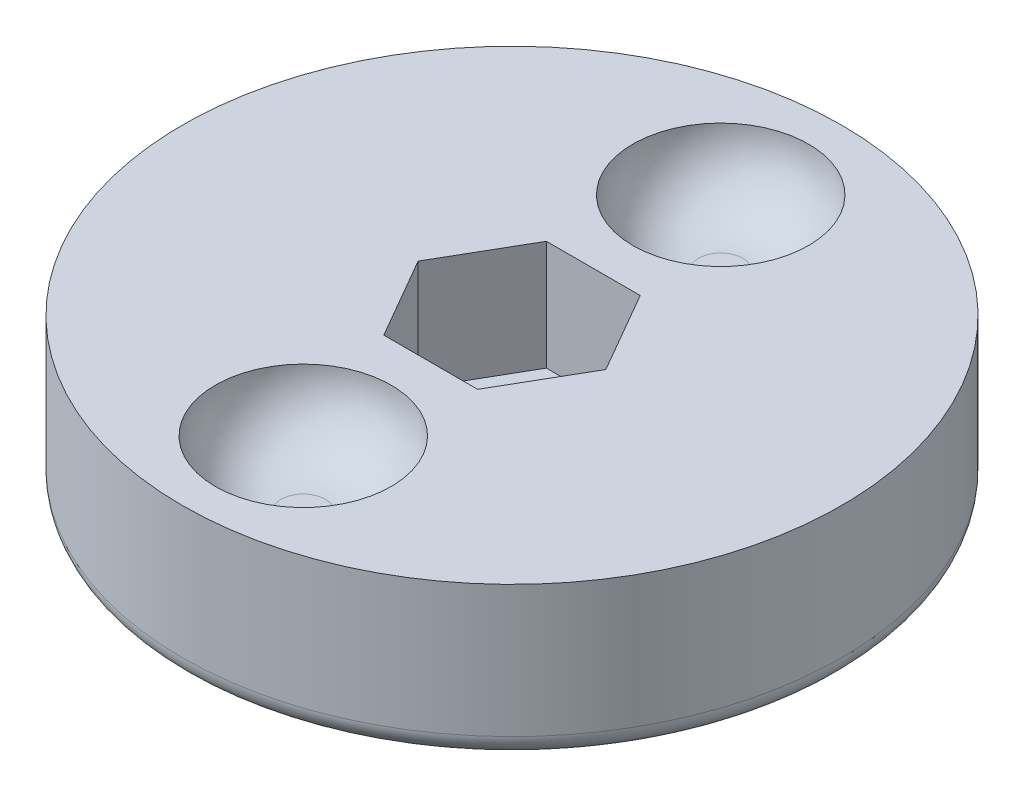
ISO-10303-21;
HEADER;
FILE_DESCRIPTION(('STEP AP214'),'2;1');
FILE_NAME('part.step','',(''),(''),'','','');
FILE_SCHEMA(('AUTOMOTIVE_DESIGN { 1 0 10303 214 1 1 1 1 }'));
ENDSEC;
DATA;
#1=APPLICATION_CONTEXT('core data for automotive mechanical design processes');
#2=APPLICATION_PROTOCOL_DEFINITION('international standard','automotive_design',2000,#1);
#3=PRODUCT_CONTEXT('',#1,'mechanical');
#4=PRODUCT('Part','Part','',(#3));
#5=PRODUCT_RELATED_PRODUCT_CATEGORY('part','',(#4));
#6=PRODUCT_DEFINITION_FORMATION('','',#4);
#7=PRODUCT_DEFINITION_CONTEXT('part definition',#1,'design');
#8=PRODUCT_DEFINITION('design','',#6,#7);
#9=PRODUCT_DEFINITION_SHAPE('','',#8);
#10=(LENGTH_UNIT() NAMED_UNIT(*) SI_UNIT(.MILLI.,.METRE.));
#11=(NAMED_UNIT(*) PLANE_ANGLE_UNIT() SI_UNIT($,.RADIAN.));
#12=(NAMED_UNIT(*) SI_UNIT($,.STERADIAN.) SOLID_ANGLE_UNIT());
#13=UNCERTAINTY_MEASURE_WITH_UNIT(LENGTH_MEASURE(1.E-05),#10,'distance_accuracy_value','');
#14=(GEOMETRIC_REPRESENTATION_CONTEXT(3) GLOBAL_UNCERTAINTY_ASSIGNED_CONTEXT((#13)) GLOBAL_UNIT_ASSIGNED_CONTEXT((#10,
#11,#12)) REPRESENTATION_CONTEXT('',''));
#15=CARTESIAN_POINT('',(0.,0.,0.));
#16=DIRECTION('',(0.,0.,1.));
#17=DIRECTION('',(1.,0.,0.));
#18=AXIS2_PLACEMENT_3D('',#15,#16,#17);
#19=CARTESIAN_POINT('',(0.,2.54,0.));
#20=DIRECTION('',(0.,1.,0.));
#21=DIRECTION('',(0.,0.,1.));
#22=AXIS2_PLACEMENT_3D('',#19,#20,#21);
#23=PLANE('',#22);
#24=CARTESIAN_POINT('',(0.,2.54,0.));
#25=DIRECTION('',(0.,1.,0.));
#26=DIRECTION('',(0.,0.,1.));
#27=AXIS2_PLACEMENT_3D('',#24,#25,#26);
#28=CIRCLE('',#27,2.794);
#29=CARTESIAN_POINT('',(0.,2.54,2.794));
#30=VERTEX_POINT('',#29);
#31=EDGE_CURVE('E175',#30,#30,#28,.T.);
#32=ORIENTED_EDGE('',*,*,#31,.F.);
#33=EDGE_LOOP('',(#32));
#34=FACE_BOUND('',#33,.T.);
#35=DIRECTION('',(1.,0.,0.));
#36=VECTOR('',#35,1.);
#37=CARTESIAN_POINT('',(-2.71296891492205,2.54,4.699));
#38=LINE('',#37,#36);
#39=CARTESIAN_POINT('',(-2.71296891492205,2.54,4.699));
#40=VERTEX_POINT('',#39);
#41=CARTESIAN_POINT('',(2.71296891492205,2.54,4.699));
#42=VERTEX_POINT('',#41);
#43=EDGE_CURVE('E108',#40,#42,#38,.T.);
#44=ORIENTED_EDGE('',*,*,#43,.T.);
#45=DIRECTION('',(0.5,0.,-0.866025403784439));
#46=VECTOR('',#45,1.);
#47=CARTESIAN_POINT('',(2.71296891492205,2.54,4.699));
#48=LINE('',#47,#46);
#49=CARTESIAN_POINT('',(5.4259378298441,2.54,0.));
#50=VERTEX_POINT('',#49);
#51=EDGE_CURVE('E138',#42,#50,#48,.T.);
#52=ORIENTED_EDGE('',*,*,#51,.T.);
#53=DIRECTION('',(-0.5,0.,-0.866025403784439));
#54=VECTOR('',#53,1.);
#55=CARTESIAN_POINT('',(5.4259378298441,2.54,0.));
#56=LINE('',#55,#54);
#57=CARTESIAN_POINT('',(2.71296891492205,2.54,-4.699));
#58=VERTEX_POINT('',#57);
#59=EDGE_CURVE('E114',#50,#58,#56,.T.);
#60=ORIENTED_EDGE('',*,*,#59,.T.);
#61=DIRECTION('',(-1.,0.,0.));
#62=VECTOR('',#61,1.);
#63=CARTESIAN_POINT('',(2.71296891492205,2.54,-4.699));
#64=LINE('',#63,#62);
#65=CARTESIAN_POINT('',(-2.71296891492205,2.54,-4.699));
#66=VERTEX_POINT('',#65);
#67=EDGE_CURVE('E144',#58,#66,#64,.T.);
#68=ORIENTED_EDGE('',*,*,#67,.T.);
#69=DIRECTION('',(-0.5,0.,0.866025403784438));
#70=VECTOR('',#69,1.);
#71=CARTESIAN_POINT('',(-2.71296891492205,2.54,-4.699));
#72=LINE('',#71,#70);
#73=CARTESIAN_POINT('',(-5.4259378298441,2.54,0.));
#74=VERTEX_POINT('',#73);
#75=EDGE_CURVE('E148',#66,#74,#72,.T.);
#76=ORIENTED_EDGE('',*,*,#75,.T.);
#77=DIRECTION('',(0.5,0.,0.866025403784439));
#78=VECTOR('',#77,1.);
#79=CARTESIAN_POINT('',(-5.4259378298441,2.54,0.));
#80=LINE('',#79,#78);
#81=EDGE_CURVE('E152',#74,#40,#80,.T.);
#82=ORIENTED_EDGE('',*,*,#81,.T.);
#83=EDGE_LOOP('',(#44,#52,#60,#68,#76,#82));
#84=FACE_BOUND('',#83,.T.);
#85=ADVANCED_FACE('F45',(#34,#84),#23,.T.);
#86=CARTESIAN_POINT('',(0.,0.,0.));
#87=DIRECTION('',(0.,1.,0.));
#88=DIRECTION('',(0.,0.,1.));
#89=AXIS2_PLACEMENT_3D('',#86,#87,#88);
#90=PLANE('',#89);
#91=CARTESIAN_POINT('',(0.,0.,0.));
#92=DIRECTION('',(0.,1.,0.));
#93=DIRECTION('',(0.,0.,1.));
#94=AXIS2_PLACEMENT_3D('',#91,#92,#93);
#95=CIRCLE('',#94,17.78);
#96=CARTESIAN_POINT('',(0.,0.,17.78));
#97=VERTEX_POINT('',#96);
#98=EDGE_CURVE('E11',#97,#97,#95,.F.);
#99=ORIENTED_EDGE('',*,*,#98,.T.);
#100=EDGE_LOOP('',(#99));
#101=FACE_BOUND('',#100,.T.);
#102=CARTESIAN_POINT('',(0.,0.,0.));
#103=DIRECTION('',(0.,1.,0.));
#104=DIRECTION('',(0.,0.,1.));
#105=AXIS2_PLACEMENT_3D('',#102,#103,#104);
#106=CIRCLE('',#105,2.794);
#107=CARTESIAN_POINT('',(0.,0.,2.794));
#108=VERTEX_POINT('',#107);
#109=EDGE_CURVE('E174',#108,#108,#106,.T.);
#110=ORIENTED_EDGE('',*,*,#109,.T.);
#111=EDGE_LOOP('',(#110));
#112=FACE_BOUND('',#111,.T.);
#113=ADVANCED_FACE('F207',(#101,#112),#90,.F.);
#114=CARTESIAN_POINT('',(0.,2.54,0.));
#115=DIRECTION('',(0.,-1.,0.));
#116=DIRECTION('',(0.,0.,-1.));
#117=AXIS2_PLACEMENT_3D('',#114,#115,#116);
#118=CYLINDRICAL_SURFACE('',#117,19.05);
#119=CARTESIAN_POINT('',(0.,1.27,0.));
#120=DIRECTION('',(0.,1.,0.));
#121=DIRECTION('',(0.,0.,1.));
#122=AXIS2_PLACEMENT_3D('',#119,#120,#121);
#123=CIRCLE('',#122,19.05);
#124=CARTESIAN_POINT('',(0.,1.27,19.05));
#125=VERTEX_POINT('',#124);
#126=EDGE_CURVE('E54',#125,#125,#123,.T.);
#127=ORIENTED_EDGE('',*,*,#126,.T.);
#128=EDGE_LOOP('',(#127));
#129=FACE_BOUND('',#128,.T.);
#130=CARTESIAN_POINT('',(0.,8.89,0.));
#131=DIRECTION('',(0.,1.,0.));
#132=DIRECTION('',(0.,0.,1.));
#133=AXIS2_PLACEMENT_3D('',#130,#131,#132);
#134=CIRCLE('',#133,19.05);
#135=CARTESIAN_POINT('',(0.,8.89,19.05));
#136=VERTEX_POINT('',#135);
#137=EDGE_CURVE('E116',#136,#136,#134,.T.);
#138=ORIENTED_EDGE('',*,*,#137,.F.);
#139=EDGE_LOOP('',(#138));
#140=FACE_BOUND('',#139,.T.);
#141=ADVANCED_FACE('F193',(#129,#140),#118,.T.);
#142=CARTESIAN_POINT('',(0.,2.54,0.));
#143=DIRECTION('',(0.,-1.,0.));
#144=DIRECTION('',(0.,0.,-1.));
#145=AXIS2_PLACEMENT_3D('',#142,#143,#144);
#146=CYLINDRICAL_SURFACE('',#145,2.794);
#147=ORIENTED_EDGE('',*,*,#31,.T.);
#148=EDGE_LOOP('',(#147));
#149=FACE_BOUND('',#148,.T.);
#150=ORIENTED_EDGE('',*,*,#109,.F.);
#151=EDGE_LOOP('',(#150));
#152=FACE_BOUND('',#151,.T.);
#153=ADVANCED_FACE('F220',(#149,#152),#146,.F.);
#154=CARTESIAN_POINT('',(0.,8.89,0.));
#155=DIRECTION('',(0.,1.,0.));
#156=DIRECTION('',(0.,0.,1.));
#157=AXIS2_PLACEMENT_3D('',#154,#155,#156);
#158=PLANE('',#157);
#159=CARTESIAN_POINT('',(0.,8.89,-12.065));
#160=DIRECTION('',(0.,1.,0.));
#161=DIRECTION('',(0.,0.,1.));
#162=AXIS2_PLACEMENT_3D('',#159,#160,#161);
#163=CIRCLE('',#162,5.08);
#164=CARTESIAN_POINT('',(0.,8.89,-6.985));
#165=VERTEX_POINT('',#164);
#166=EDGE_CURVE('E141',#165,#165,#163,.T.);
#167=ORIENTED_EDGE('',*,*,#166,.F.);
#168=EDGE_LOOP('',(#167));
#169=FACE_BOUND('',#168,.T.);
#170=CARTESIAN_POINT('',(0.,8.89,12.065));
#171=DIRECTION('',(0.,1.,0.));
#172=DIRECTION('',(0.,0.,1.));
#173=AXIS2_PLACEMENT_3D('',#170,#171,#172);
#174=CIRCLE('',#173,5.08);
#175=CARTESIAN_POINT('',(0.,8.89,17.145));
#176=VERTEX_POINT('',#175);
#177=EDGE_CURVE('E236',#176,#176,#174,.T.);
#178=ORIENTED_EDGE('',*,*,#177,.F.);
#179=EDGE_LOOP('',(#178));
#180=FACE_BOUND('',#179,.T.);
#181=ORIENTED_EDGE('',*,*,#137,.T.);
#182=EDGE_LOOP('',(#181));
#183=FACE_BOUND('',#182,.T.);
#184=DIRECTION('',(-0.5,0.,-0.866025403784439));
#185=VECTOR('',#184,1.);
#186=CARTESIAN_POINT('',(5.4259378298441,8.89,0.));
#187=LINE('',#186,#185);
#188=CARTESIAN_POINT('',(5.4259378298441,8.89,0.));
#189=VERTEX_POINT('',#188);
#190=CARTESIAN_POINT('',(2.71296891492205,8.89,-4.699));
#191=VERTEX_POINT('',#190);
#192=EDGE_CURVE('E107',#189,#191,#187,.T.);
#193=ORIENTED_EDGE('',*,*,#192,.F.);
#194=DIRECTION('',(0.5,0.,-0.866025403784439));
#195=VECTOR('',#194,1.);
#196=CARTESIAN_POINT('',(2.71296891492205,8.89,4.699));
#197=LINE('',#196,#195);
#198=CARTESIAN_POINT('',(2.71296891492205,8.89,4.699));
#199=VERTEX_POINT('',#198);
#200=EDGE_CURVE('E98',#199,#189,#197,.T.);
#201=ORIENTED_EDGE('',*,*,#200,.F.);
#202=DIRECTION('',(1.,0.,0.));
#203=VECTOR('',#202,1.);
#204=CARTESIAN_POINT('',(-2.71296891492205,8.89,4.699));
#205=LINE('',#204,#203);
#206=CARTESIAN_POINT('',(-2.71296891492205,8.89,4.699));
#207=VERTEX_POINT('',#206);
#208=EDGE_CURVE('E135',#207,#199,#205,.T.);
#209=ORIENTED_EDGE('',*,*,#208,.F.);
#210=DIRECTION('',(0.5,0.,0.866025403784439));
#211=VECTOR('',#210,1.);
#212=CARTESIAN_POINT('',(-5.4259378298441,8.89,0.));
#213=LINE('',#212,#211);
#214=CARTESIAN_POINT('',(-5.4259378298441,8.89,0.));
#215=VERTEX_POINT('',#214);
#216=EDGE_CURVE('E132',#215,#207,#213,.T.);
#217=ORIENTED_EDGE('',*,*,#216,.F.);
#218=DIRECTION('',(-0.5,0.,0.866025403784438));
#219=VECTOR('',#218,1.);
#220=CARTESIAN_POINT('',(-2.71296891492205,8.89,-4.699));
#221=LINE('',#220,#219);
#222=CARTESIAN_POINT('',(-2.71296891492205,8.89,-4.699));
#223=VERTEX_POINT('',#222);
#224=EDGE_CURVE('E126',#223,#215,#221,.T.);
#225=ORIENTED_EDGE('',*,*,#224,.F.);
#226=DIRECTION('',(-1.,0.,0.));
#227=VECTOR('',#226,1.);
#228=CARTESIAN_POINT('',(2.71296891492205,8.89,-4.699));
#229=LINE('',#228,#227);
#230=EDGE_CURVE('E122',#191,#223,#229,.T.);
#231=ORIENTED_EDGE('',*,*,#230,.F.);
#232=EDGE_LOOP('',(#193,#201,#209,#217,#225,#231));
#233=FACE_BOUND('',#232,.T.);
#234=ADVANCED_FACE('F120',(#169,#180,#183,#233),#158,.T.);
#235=CARTESIAN_POINT('',(2.71296891492205,8.89,4.699));
#236=DIRECTION('',(-0.866025403784439,0.,-0.5));
#237=DIRECTION('',(-0.5,0.,0.866025403784439));
#238=AXIS2_PLACEMENT_3D('',#235,#236,#237);
#239=PLANE('',#238);
#240=ORIENTED_EDGE('',*,*,#51,.F.);
#241=DIRECTION('',(0.,-1.,0.));
#242=VECTOR('',#241,1.);
#243=CARTESIAN_POINT('',(2.71296891492205,8.89,4.699));
#244=LINE('',#243,#242);
#245=EDGE_CURVE('E61',#199,#42,#244,.T.);
#246=ORIENTED_EDGE('',*,*,#245,.F.);
#247=ORIENTED_EDGE('',*,*,#200,.T.);
#248=DIRECTION('',(0.,-1.,0.));
#249=VECTOR('',#248,1.);
#250=CARTESIAN_POINT('',(5.4259378298441,8.89,0.));
#251=LINE('',#250,#249);
#252=EDGE_CURVE('E101',#189,#50,#251,.T.);
#253=ORIENTED_EDGE('',*,*,#252,.T.);
#254=EDGE_LOOP('',(#240,#246,#247,#253));
#255=FACE_BOUND('',#254,.T.);
#256=ADVANCED_FACE('F100',(#255),#239,.T.);
#257=CARTESIAN_POINT('',(5.4259378298441,8.89,0.));
#258=DIRECTION('',(-0.866025403784438,0.,0.5));
#259=DIRECTION('',(0.5,0.,0.866025403784439));
#260=AXIS2_PLACEMENT_3D('',#257,#258,#259);
#261=PLANE('',#260);
#262=ORIENTED_EDGE('',*,*,#59,.F.);
#263=ORIENTED_EDGE('',*,*,#252,.F.);
#264=ORIENTED_EDGE('',*,*,#192,.T.);
#265=DIRECTION('',(0.,-1.,0.));
#266=VECTOR('',#265,1.);
#267=CARTESIAN_POINT('',(2.71296891492205,8.89,-4.699));
#268=LINE('',#267,#266);
#269=EDGE_CURVE('E117',#191,#58,#268,.T.);
#270=ORIENTED_EDGE('',*,*,#269,.T.);
#271=EDGE_LOOP('',(#262,#263,#264,#270));
#272=FACE_BOUND('',#271,.T.);
#273=ADVANCED_FACE('F111',(#272),#261,.T.);
#274=CARTESIAN_POINT('',(2.71296891492205,8.89,-4.699));
#275=DIRECTION('',(0.,0.,1.));
#276=DIRECTION('',(1.,0.,0.));
#277=AXIS2_PLACEMENT_3D('',#274,#275,#276);
#278=PLANE('',#277);
#279=ORIENTED_EDGE('',*,*,#67,.F.);
#280=ORIENTED_EDGE('',*,*,#269,.F.);
#281=ORIENTED_EDGE('',*,*,#230,.T.);
#282=DIRECTION('',(0.,-1.,0.));
#283=VECTOR('',#282,1.);
#284=CARTESIAN_POINT('',(-2.71296891492205,8.89,-4.699));
#285=LINE('',#284,#283);
#286=EDGE_CURVE('E166',#223,#66,#285,.T.);
#287=ORIENTED_EDGE('',*,*,#286,.T.);
#288=EDGE_LOOP('',(#279,#280,#281,#287));
#289=FACE_BOUND('',#288,.T.);
#290=ADVANCED_FACE('F255',(#289),#278,.T.);
#291=CARTESIAN_POINT('',(-2.71296891492205,8.89,-4.699));
#292=DIRECTION('',(0.866025403784438,0.,0.5));
#293=DIRECTION('',(0.5,0.,-0.866025403784439));
#294=AXIS2_PLACEMENT_3D('',#291,#292,#293);
#295=PLANE('',#294);
#296=ORIENTED_EDGE('',*,*,#75,.F.);
#297=ORIENTED_EDGE('',*,*,#286,.F.);
#298=ORIENTED_EDGE('',*,*,#224,.T.);
#299=DIRECTION('',(0.,-1.,0.));
#300=VECTOR('',#299,1.);
#301=CARTESIAN_POINT('',(-5.4259378298441,8.89,0.));
#302=LINE('',#301,#300);
#303=EDGE_CURVE('E163',#215,#74,#302,.T.);
#304=ORIENTED_EDGE('',*,*,#303,.T.);
#305=EDGE_LOOP('',(#296,#297,#298,#304));
#306=FACE_BOUND('',#305,.T.);
#307=ADVANCED_FACE('F251',(#306),#295,.T.);
#308=CARTESIAN_POINT('',(-5.4259378298441,8.89,0.));
#309=DIRECTION('',(0.866025403784438,0.,-0.5));
#310=DIRECTION('',(-0.5,0.,-0.866025403784439));
#311=AXIS2_PLACEMENT_3D('',#308,#309,#310);
#312=PLANE('',#311);
#313=ORIENTED_EDGE('',*,*,#81,.F.);
#314=ORIENTED_EDGE('',*,*,#303,.F.);
#315=ORIENTED_EDGE('',*,*,#216,.T.);
#316=DIRECTION('',(0.,-1.,0.));
#317=VECTOR('',#316,1.);
#318=CARTESIAN_POINT('',(-2.71296891492205,8.89,4.699));
#319=LINE('',#318,#317);
#320=EDGE_CURVE('E66',#207,#40,#319,.T.);
#321=ORIENTED_EDGE('',*,*,#320,.T.);
#322=EDGE_LOOP('',(#313,#314,#315,#321));
#323=FACE_BOUND('',#322,.T.);
#324=ADVANCED_FACE('F246',(#323),#312,.T.);
#325=CARTESIAN_POINT('',(-2.71296891492205,8.89,4.699));
#326=DIRECTION('',(0.,0.,-1.));
#327=DIRECTION('',(-1.,0.,0.));
#328=AXIS2_PLACEMENT_3D('',#325,#326,#327);
#329=PLANE('',#328);
#330=ORIENTED_EDGE('',*,*,#43,.F.);
#331=ORIENTED_EDGE('',*,*,#320,.F.);
#332=ORIENTED_EDGE('',*,*,#208,.T.);
#333=ORIENTED_EDGE('',*,*,#245,.T.);
#334=EDGE_LOOP('',(#330,#331,#332,#333));
#335=FACE_BOUND('',#334,.T.);
#336=ADVANCED_FACE('F240',(#335),#329,.T.);
#337=CARTESIAN_POINT('',(0.,5.08,12.065));
#338=DIRECTION('',(0.,1.,0.));
#339=DIRECTION('',(0.,0.,1.));
#340=AXIS2_PLACEMENT_3D('',#337,#338,#339);
#341=PLANE('',#340);
#342=CARTESIAN_POINT('',(0.,5.08,12.065));
#343=DIRECTION('',(0.,1.,0.));
#344=DIRECTION('',(0.,0.,1.));
#345=AXIS2_PLACEMENT_3D('',#342,#343,#344);
#346=CIRCLE('',#345,1.27);
#347=CARTESIAN_POINT('',(0.,5.08,13.335));
#348=VERTEX_POINT('',#347);
#349=EDGE_CURVE('E179',#348,#348,#346,.T.);
#350=ORIENTED_EDGE('',*,*,#349,.T.);
#351=EDGE_LOOP('',(#350));
#352=FACE_BOUND('',#351,.T.);
#353=ADVANCED_FACE('F230',(#352),#341,.T.);
#354=CARTESIAN_POINT('',(0.,5.08,-12.065));
#355=DIRECTION('',(0.,1.,0.));
#356=DIRECTION('',(0.,0.,1.));
#357=AXIS2_PLACEMENT_3D('',#354,#355,#356);
#358=PLANE('',#357);
#359=CARTESIAN_POINT('',(0.,5.08,-12.065));
#360=DIRECTION('',(0.,1.,0.));
#361=DIRECTION('',(0.,0.,1.));
#362=AXIS2_PLACEMENT_3D('',#359,#360,#361);
#363=CIRCLE('',#362,1.27);
#364=CARTESIAN_POINT('',(0.,5.08,-10.795));
#365=VERTEX_POINT('',#364);
#366=EDGE_CURVE('E186',#365,#365,#363,.T.);
#367=ORIENTED_EDGE('',*,*,#366,.T.);
#368=EDGE_LOOP('',(#367));
#369=FACE_BOUND('',#368,.T.);
#370=ADVANCED_FACE('F225',(#369),#358,.T.);
#371=CARTESIAN_POINT('',(0.,8.89,12.065));
#372=DIRECTION('',(0.,1.,0.));
#373=DIRECTION('',(0.,0.,1.));
#374=AXIS2_PLACEMENT_3D('',#371,#372,#373);
#375=DEGENERATE_TOROIDAL_SURFACE('',#374,1.27,3.81,.T.);
#376=ORIENTED_EDGE('',*,*,#177,.T.);
#377=EDGE_LOOP('',(#376));
#378=FACE_BOUND('',#377,.T.);
#379=ORIENTED_EDGE('',*,*,#349,.F.);
#380=EDGE_LOOP('',(#379));
#381=FACE_BOUND('',#380,.T.);
#382=ADVANCED_FACE('F203',(#378,#381),#375,.F.);
#383=CARTESIAN_POINT('',(0.,8.89,-12.065));
#384=DIRECTION('',(0.,1.,0.));
#385=DIRECTION('',(0.,0.,1.));
#386=AXIS2_PLACEMENT_3D('',#383,#384,#385);
#387=DEGENERATE_TOROIDAL_SURFACE('',#386,1.27,3.81,.T.);
#388=ORIENTED_EDGE('',*,*,#166,.T.);
#389=EDGE_LOOP('',(#388));
#390=FACE_BOUND('',#389,.T.);
#391=ORIENTED_EDGE('',*,*,#366,.F.);
#392=EDGE_LOOP('',(#391));
#393=FACE_BOUND('',#392,.T.);
#394=ADVANCED_FACE('F197',(#390,#393),#387,.F.);
#395=CARTESIAN_POINT('',(0.,1.27,0.));
#396=DIRECTION('',(0.,1.,0.));
#397=DIRECTION('',(0.,0.,1.));
#398=AXIS2_PLACEMENT_3D('',#395,#396,#397);
#399=TOROIDAL_SURFACE('',#398,17.78,1.27);
#400=ORIENTED_EDGE('',*,*,#98,.F.);
#401=EDGE_LOOP('',(#400));
#402=FACE_BOUND('',#401,.T.);
#403=ORIENTED_EDGE('',*,*,#126,.F.);
#404=EDGE_LOOP('',(#403));
#405=FACE_BOUND('',#404,.T.);
#406=ADVANCED_FACE('F47',(#402,#405),#399,.T.);
#407=CLOSED_SHELL('',(#85,#113,#141,#153,#234,#256,#273,#290,#307,#324,#336,#353,#370,#382,#394,#406));
#408=MANIFOLD_SOLID_BREP('B2',#407);
#409=ADVANCED_BREP_SHAPE_REPRESENTATION('',(#18,#408),#14);
#410=SHAPE_DEFINITION_REPRESENTATION(#9,#409);
ENDSEC;
END-ISO-10303-21;
